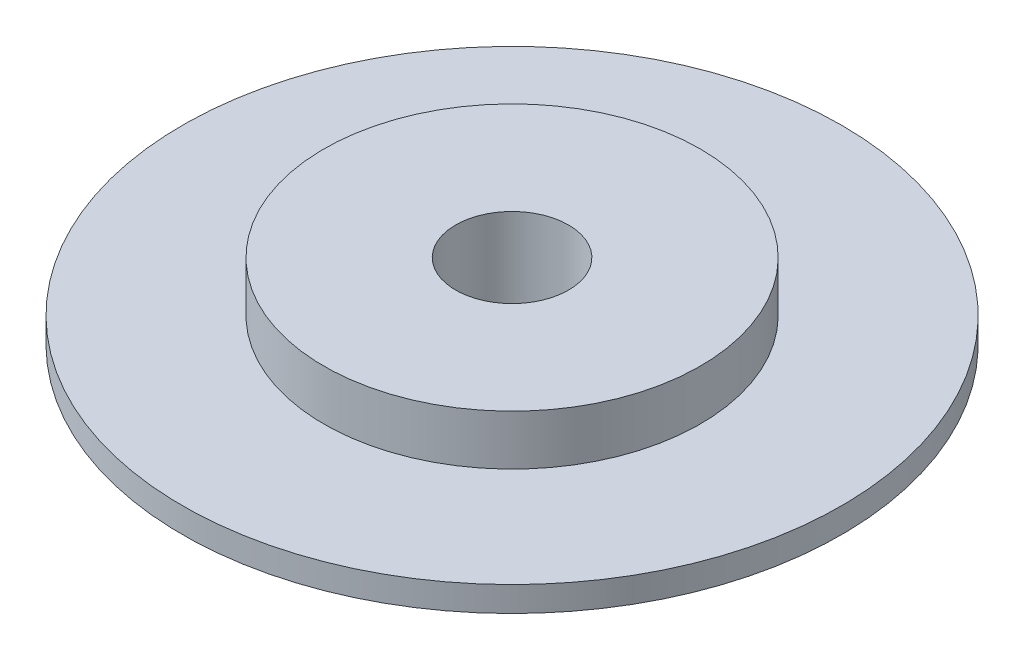
ISO-10303-21;
HEADER;
FILE_DESCRIPTION(('STEP AP214'),'2;1');
FILE_NAME('part.step','',(''),(''),'','','');
FILE_SCHEMA(('AUTOMOTIVE_DESIGN { 1 0 10303 214 1 1 1 1 }'));
ENDSEC;
DATA;
#1=APPLICATION_CONTEXT('core data for automotive mechanical design processes');
#2=APPLICATION_PROTOCOL_DEFINITION('international standard','automotive_design',2000,#1);
#3=PRODUCT_CONTEXT('',#1,'mechanical');
#4=PRODUCT('Part','Part','',(#3));
#5=PRODUCT_RELATED_PRODUCT_CATEGORY('part','',(#4));
#6=PRODUCT_DEFINITION_FORMATION('','',#4);
#7=PRODUCT_DEFINITION_CONTEXT('part definition',#1,'design');
#8=PRODUCT_DEFINITION('design','',#6,#7);
#9=PRODUCT_DEFINITION_SHAPE('','',#8);
#10=(LENGTH_UNIT() NAMED_UNIT(*) SI_UNIT(.MILLI.,.METRE.));
#11=(NAMED_UNIT(*) PLANE_ANGLE_UNIT() SI_UNIT($,.RADIAN.));
#12=(NAMED_UNIT(*) SI_UNIT($,.STERADIAN.) SOLID_ANGLE_UNIT());
#13=UNCERTAINTY_MEASURE_WITH_UNIT(LENGTH_MEASURE(1.E-05),#10,'distance_accuracy_value','');
#14=(GEOMETRIC_REPRESENTATION_CONTEXT(3) GLOBAL_UNCERTAINTY_ASSIGNED_CONTEXT((#13)) GLOBAL_UNIT_ASSIGNED_CONTEXT((#10,
#11,#12)) REPRESENTATION_CONTEXT('',''));
#15=CARTESIAN_POINT('',(0.,0.,0.));
#16=DIRECTION('',(0.,0.,1.));
#17=DIRECTION('',(1.,0.,0.));
#18=AXIS2_PLACEMENT_3D('',#15,#16,#17);
#19=CARTESIAN_POINT('',(-7.50000000000001,1.7733644859813,0.));
#20=DIRECTION('',(0.,1.,0.));
#21=DIRECTION('',(0.,0.,1.));
#22=AXIS2_PLACEMENT_3D('',#19,#20,#21);
#23=PLANE('',#22);
#24=CARTESIAN_POINT('',(0.,1.7733644859813,0.));
#25=DIRECTION('',(0.,-1.,0.));
#26=DIRECTION('',(0.,0.,-1.));
#27=AXIS2_PLACEMENT_3D('',#24,#25,#26);
#28=CIRCLE('',#27,2.25);
#29=CARTESIAN_POINT('',(0.,1.7733644859813,-2.25));
#30=VERTEX_POINT('',#29);
#31=EDGE_CURVE('E10',#30,#30,#28,.T.);
#32=ORIENTED_EDGE('',*,*,#31,.F.);
#33=EDGE_LOOP('',(#32));
#34=FACE_BOUND('',#33,.T.);
#35=CARTESIAN_POINT('',(0.,1.7733644859813,0.));
#36=DIRECTION('',(0.,-1.,0.));
#37=DIRECTION('',(0.,0.,-1.));
#38=AXIS2_PLACEMENT_3D('',#35,#36,#37);
#39=CIRCLE('',#38,7.50000000000001);
#40=CARTESIAN_POINT('',(0.,1.7733644859813,-7.50000000000001));
#41=VERTEX_POINT('',#40);
#42=EDGE_CURVE('E72',#41,#41,#39,.T.);
#43=ORIENTED_EDGE('',*,*,#42,.T.);
#44=EDGE_LOOP('',(#43));
#45=FACE_BOUND('',#44,.T.);
#46=ADVANCED_FACE('F37',(#34,#45),#23,.F.);
#47=CARTESIAN_POINT('',(0.,0.,0.));
#48=DIRECTION('',(0.,-1.,0.));
#49=DIRECTION('',(0.,0.,-1.));
#50=AXIS2_PLACEMENT_3D('',#47,#48,#49);
#51=CYLINDRICAL_SURFACE('',#50,2.25);
#52=CARTESIAN_POINT('',(0.,6.77336448598131,0.));
#53=DIRECTION('',(0.,-1.,0.));
#54=DIRECTION('',(0.,0.,-1.));
#55=AXIS2_PLACEMENT_3D('',#52,#53,#54);
#56=CIRCLE('',#55,2.25);
#57=CARTESIAN_POINT('',(0.,6.77336448598131,-2.25));
#58=VERTEX_POINT('',#57);
#59=EDGE_CURVE('E44',#58,#58,#56,.T.);
#60=ORIENTED_EDGE('',*,*,#59,.F.);
#61=EDGE_LOOP('',(#60));
#62=FACE_BOUND('',#61,.T.);
#63=ORIENTED_EDGE('',*,*,#31,.T.);
#64=EDGE_LOOP('',(#63));
#65=FACE_BOUND('',#64,.T.);
#66=ADVANCED_FACE('F110',(#62,#65),#51,.F.);
#67=CARTESIAN_POINT('',(-2.25,6.77336448598131,0.));
#68=DIRECTION('',(0.,-1.,0.));
#69=DIRECTION('',(0.,0.,-1.));
#70=AXIS2_PLACEMENT_3D('',#67,#68,#69);
#71=PLANE('',#70);
#72=CARTESIAN_POINT('',(0.,6.7733644859813,0.));
#73=DIRECTION('',(0.,-1.,0.));
#74=DIRECTION('',(0.,0.,-1.));
#75=AXIS2_PLACEMENT_3D('',#72,#73,#74);
#76=CIRCLE('',#75,7.5);
#77=CARTESIAN_POINT('',(0.,6.7733644859813,-7.5));
#78=VERTEX_POINT('',#77);
#79=EDGE_CURVE('E49',#78,#78,#76,.T.);
#80=ORIENTED_EDGE('',*,*,#79,.F.);
#81=EDGE_LOOP('',(#80));
#82=FACE_BOUND('',#81,.T.);
#83=ORIENTED_EDGE('',*,*,#59,.T.);
#84=EDGE_LOOP('',(#83));
#85=FACE_BOUND('',#84,.T.);
#86=ADVANCED_FACE('F105',(#82,#85),#71,.F.);
#87=CARTESIAN_POINT('',(0.,0.,0.));
#88=DIRECTION('',(0.,-1.,0.));
#89=DIRECTION('',(0.,0.,-1.));
#90=AXIS2_PLACEMENT_3D('',#87,#88,#89);
#91=CYLINDRICAL_SURFACE('',#90,7.5);
#92=CARTESIAN_POINT('',(0.,4.7733644859813,0.));
#93=DIRECTION('',(0.,-1.,0.));
#94=DIRECTION('',(0.,0.,-1.));
#95=AXIS2_PLACEMENT_3D('',#92,#93,#94);
#96=CIRCLE('',#95,7.5);
#97=CARTESIAN_POINT('',(0.,4.7733644859813,-7.5));
#98=VERTEX_POINT('',#97);
#99=EDGE_CURVE('E54',#98,#98,#96,.T.);
#100=ORIENTED_EDGE('',*,*,#99,.F.);
#101=EDGE_LOOP('',(#100));
#102=FACE_BOUND('',#101,.T.);
#103=ORIENTED_EDGE('',*,*,#79,.T.);
#104=EDGE_LOOP('',(#103));
#105=FACE_BOUND('',#104,.T.);
#106=ADVANCED_FACE('F99',(#102,#105),#91,.T.);
#107=CARTESIAN_POINT('',(-7.5,4.7733644859813,0.));
#108=DIRECTION('',(0.,-1.,0.));
#109=DIRECTION('',(0.,0.,-1.));
#110=AXIS2_PLACEMENT_3D('',#107,#108,#109);
#111=PLANE('',#110);
#112=CARTESIAN_POINT('',(0.,4.7733644859813,0.));
#113=DIRECTION('',(0.,-1.,0.));
#114=DIRECTION('',(0.,0.,-1.));
#115=AXIS2_PLACEMENT_3D('',#112,#113,#114);
#116=CIRCLE('',#115,13.1355140186916);
#117=CARTESIAN_POINT('',(0.,4.7733644859813,-13.1355140186916));
#118=VERTEX_POINT('',#117);
#119=EDGE_CURVE('E60',#118,#118,#116,.T.);
#120=ORIENTED_EDGE('',*,*,#119,.F.);
#121=EDGE_LOOP('',(#120));
#122=FACE_BOUND('',#121,.T.);
#123=ORIENTED_EDGE('',*,*,#99,.T.);
#124=EDGE_LOOP('',(#123));
#125=FACE_BOUND('',#124,.T.);
#126=ADVANCED_FACE('F93',(#122,#125),#111,.F.);
#127=CARTESIAN_POINT('',(0.,0.,0.));
#128=DIRECTION('',(0.,-1.,0.));
#129=DIRECTION('',(0.,0.,-1.));
#130=AXIS2_PLACEMENT_3D('',#127,#128,#129);
#131=CYLINDRICAL_SURFACE('',#130,13.1355140186916);
#132=CARTESIAN_POINT('',(0.,3.7733644859813,0.));
#133=DIRECTION('',(0.,-1.,0.));
#134=DIRECTION('',(0.,0.,-1.));
#135=AXIS2_PLACEMENT_3D('',#132,#133,#134);
#136=CIRCLE('',#135,13.1355140186916);
#137=CARTESIAN_POINT('',(0.,3.7733644859813,-13.1355140186916));
#138=VERTEX_POINT('',#137);
#139=EDGE_CURVE('E64',#138,#138,#136,.T.);
#140=ORIENTED_EDGE('',*,*,#139,.F.);
#141=EDGE_LOOP('',(#140));
#142=FACE_BOUND('',#141,.T.);
#143=ORIENTED_EDGE('',*,*,#119,.T.);
#144=EDGE_LOOP('',(#143));
#145=FACE_BOUND('',#144,.T.);
#146=ADVANCED_FACE('F87',(#142,#145),#131,.T.);
#147=CARTESIAN_POINT('',(-13.1355140186916,3.7733644859813,0.));
#148=DIRECTION('',(0.,1.,0.));
#149=DIRECTION('',(0.,0.,1.));
#150=AXIS2_PLACEMENT_3D('',#147,#148,#149);
#151=PLANE('',#150);
#152=CARTESIAN_POINT('',(0.,3.7733644859813,0.));
#153=DIRECTION('',(0.,-1.,0.));
#154=DIRECTION('',(0.,0.,-1.));
#155=AXIS2_PLACEMENT_3D('',#152,#153,#154);
#156=CIRCLE('',#155,7.50000000000001);
#157=CARTESIAN_POINT('',(0.,3.7733644859813,-7.50000000000001));
#158=VERTEX_POINT('',#157);
#159=EDGE_CURVE('E68',#158,#158,#156,.T.);
#160=ORIENTED_EDGE('',*,*,#159,.F.);
#161=EDGE_LOOP('',(#160));
#162=FACE_BOUND('',#161,.T.);
#163=ORIENTED_EDGE('',*,*,#139,.T.);
#164=EDGE_LOOP('',(#163));
#165=FACE_BOUND('',#164,.T.);
#166=ADVANCED_FACE('F81',(#162,#165),#151,.F.);
#167=CARTESIAN_POINT('',(0.,0.,0.));
#168=DIRECTION('',(0.,-1.,0.));
#169=DIRECTION('',(0.,0.,-1.));
#170=AXIS2_PLACEMENT_3D('',#167,#168,#169);
#171=CYLINDRICAL_SURFACE('',#170,7.50000000000001);
#172=ORIENTED_EDGE('',*,*,#42,.F.);
#173=EDGE_LOOP('',(#172));
#174=FACE_BOUND('',#173,.T.);
#175=ORIENTED_EDGE('',*,*,#159,.T.);
#176=EDGE_LOOP('',(#175));
#177=FACE_BOUND('',#176,.T.);
#178=ADVANCED_FACE('F78',(#174,#177),#171,.T.);
#179=CLOSED_SHELL('',(#46,#66,#86,#106,#126,#146,#166,#178));
#180=MANIFOLD_SOLID_BREP('B2',#179);
#181=ADVANCED_BREP_SHAPE_REPRESENTATION('',(#18,#180),#14);
#182=SHAPE_DEFINITION_REPRESENTATION(#9,#181);
ENDSEC;
END-ISO-10303-21;
